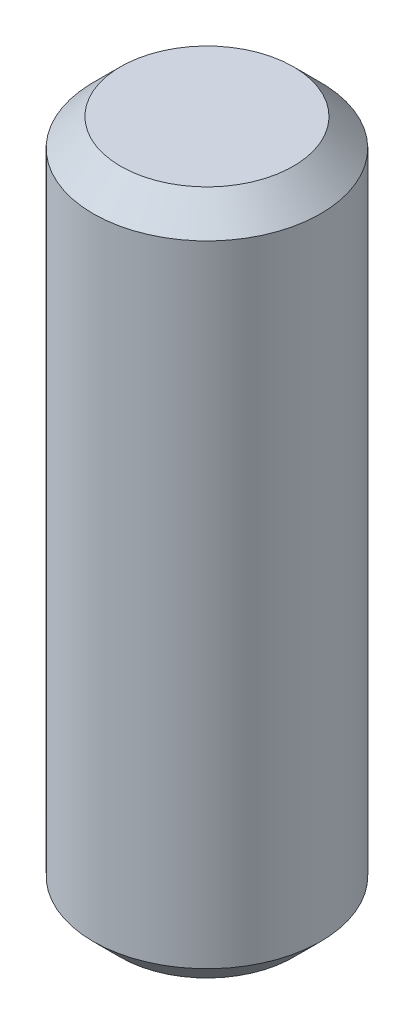
ISO-10303-21;
HEADER;
FILE_DESCRIPTION(('STEP AP214'),'2;1');
FILE_NAME('part.step','',(''),(''),'','','');
FILE_SCHEMA(('AUTOMOTIVE_DESIGN { 1 0 10303 214 1 1 1 1 }'));
ENDSEC;
DATA;
#1=APPLICATION_CONTEXT('core data for automotive mechanical design processes');
#2=APPLICATION_PROTOCOL_DEFINITION('international standard','automotive_design',2000,#1);
#3=PRODUCT_CONTEXT('',#1,'mechanical');
#4=PRODUCT('Part','Part','',(#3));
#5=PRODUCT_RELATED_PRODUCT_CATEGORY('part','',(#4));
#6=PRODUCT_DEFINITION_FORMATION('','',#4);
#7=PRODUCT_DEFINITION_CONTEXT('part definition',#1,'design');
#8=PRODUCT_DEFINITION('design','',#6,#7);
#9=PRODUCT_DEFINITION_SHAPE('','',#8);
#10=(LENGTH_UNIT() NAMED_UNIT(*) SI_UNIT(.MILLI.,.METRE.));
#11=(NAMED_UNIT(*) PLANE_ANGLE_UNIT() SI_UNIT($,.RADIAN.));
#12=(NAMED_UNIT(*) SI_UNIT($,.STERADIAN.) SOLID_ANGLE_UNIT());
#13=UNCERTAINTY_MEASURE_WITH_UNIT(LENGTH_MEASURE(1.E-05),#10,'distance_accuracy_value','');
#14=(GEOMETRIC_REPRESENTATION_CONTEXT(3) GLOBAL_UNCERTAINTY_ASSIGNED_CONTEXT((#13)) GLOBAL_UNIT_ASSIGNED_CONTEXT((#10,
#11,#12)) REPRESENTATION_CONTEXT('',''));
#15=CARTESIAN_POINT('',(0.,0.,0.));
#16=DIRECTION('',(0.,0.,1.));
#17=DIRECTION('',(1.,0.,0.));
#18=AXIS2_PLACEMENT_3D('',#15,#16,#17);
#19=CARTESIAN_POINT('',(0.,25.,0.));
#20=DIRECTION('',(0.,-1.,0.));
#21=DIRECTION('',(0.,0.,-1.));
#22=AXIS2_PLACEMENT_3D('',#19,#20,#21);
#23=CYLINDRICAL_SURFACE('',#22,4.15);
#24=CARTESIAN_POINT('',(0.,1.00000000000001,0.));
#25=DIRECTION('',(0.,1.,0.));
#26=DIRECTION('',(0.,0.,1.));
#27=AXIS2_PLACEMENT_3D('',#24,#25,#26);
#28=CIRCLE('',#27,4.15);
#29=CARTESIAN_POINT('',(0.,1.00000000000001,4.15));
#30=VERTEX_POINT('',#29);
#31=EDGE_CURVE('E53',#30,#30,#28,.T.);
#32=ORIENTED_EDGE('',*,*,#31,.T.);
#33=EDGE_LOOP('',(#32));
#34=FACE_BOUND('',#33,.T.);
#35=CARTESIAN_POINT('',(0.,24.,0.));
#36=DIRECTION('',(0.,1.,0.));
#37=DIRECTION('',(0.,0.,1.));
#38=AXIS2_PLACEMENT_3D('',#35,#36,#37);
#39=CIRCLE('',#38,4.15);
#40=CARTESIAN_POINT('',(0.,24.,4.15));
#41=VERTEX_POINT('',#40);
#42=EDGE_CURVE('E57',#41,#41,#39,.F.);
#43=ORIENTED_EDGE('',*,*,#42,.T.);
#44=EDGE_LOOP('',(#43));
#45=FACE_BOUND('',#44,.T.);
#46=ADVANCED_FACE('F41',(#34,#45),#23,.T.);
#47=CARTESIAN_POINT('',(0.,25.,0.));
#48=DIRECTION('',(0.,1.,0.));
#49=DIRECTION('',(0.,0.,1.));
#50=AXIS2_PLACEMENT_3D('',#47,#48,#49);
#51=PLANE('',#50);
#52=CARTESIAN_POINT('',(0.,25.,0.));
#53=DIRECTION('',(0.,1.,0.));
#54=DIRECTION('',(0.,0.,1.));
#55=AXIS2_PLACEMENT_3D('',#52,#53,#54);
#56=CIRCLE('',#55,3.14999999999999);
#57=CARTESIAN_POINT('',(0.,25.,3.14999999999999));
#58=VERTEX_POINT('',#57);
#59=EDGE_CURVE('E10',#58,#58,#56,.T.);
#60=ORIENTED_EDGE('',*,*,#59,.T.);
#61=EDGE_LOOP('',(#60));
#62=FACE_BOUND('',#61,.T.);
#63=ADVANCED_FACE('F73',(#62),#51,.T.);
#64=CARTESIAN_POINT('',(0.,0.,0.));
#65=DIRECTION('',(0.,1.,0.));
#66=DIRECTION('',(0.,0.,1.));
#67=AXIS2_PLACEMENT_3D('',#64,#65,#66);
#68=PLANE('',#67);
#69=CARTESIAN_POINT('',(0.,0.,0.));
#70=DIRECTION('',(0.,1.,0.));
#71=DIRECTION('',(0.,0.,1.));
#72=AXIS2_PLACEMENT_3D('',#69,#70,#71);
#73=CIRCLE('',#72,3.14999999999999);
#74=CARTESIAN_POINT('',(0.,0.,3.14999999999999));
#75=VERTEX_POINT('',#74);
#76=EDGE_CURVE('E49',#75,#75,#73,.F.);
#77=ORIENTED_EDGE('',*,*,#76,.T.);
#78=EDGE_LOOP('',(#77));
#79=FACE_BOUND('',#78,.T.);
#80=ADVANCED_FACE('F70',(#79),#68,.F.);
#81=CARTESIAN_POINT('',(0.,1.00000000000001,0.));
#82=DIRECTION('',(0.,1.,0.));
#83=DIRECTION('',(0.,0.,1.));
#84=AXIS2_PLACEMENT_3D('',#81,#82,#83);
#85=CONICAL_SURFACE('',#84,4.15,0.78539816339745);
#86=ORIENTED_EDGE('',*,*,#76,.F.);
#87=EDGE_LOOP('',(#86));
#88=FACE_BOUND('',#87,.T.);
#89=ORIENTED_EDGE('',*,*,#31,.F.);
#90=EDGE_LOOP('',(#89));
#91=FACE_BOUND('',#90,.T.);
#92=ADVANCED_FACE('F66',(#88,#91),#85,.T.);
#93=CARTESIAN_POINT('',(0.,25.,0.));
#94=DIRECTION('',(0.,-1.,0.));
#95=DIRECTION('',(0.,0.,-1.));
#96=AXIS2_PLACEMENT_3D('',#93,#94,#95);
#97=CONICAL_SURFACE('',#96,3.14999999999999,0.785398163397446);
#98=ORIENTED_EDGE('',*,*,#42,.F.);
#99=EDGE_LOOP('',(#98));
#100=FACE_BOUND('',#99,.T.);
#101=ORIENTED_EDGE('',*,*,#59,.F.);
#102=EDGE_LOOP('',(#101));
#103=FACE_BOUND('',#102,.T.);
#104=ADVANCED_FACE('F44',(#100,#103),#97,.T.);
#105=CLOSED_SHELL('',(#46,#63,#80,#92,#104));
#106=MANIFOLD_SOLID_BREP('B2',#105);
#107=ADVANCED_BREP_SHAPE_REPRESENTATION('',(#18,#106),#14);
#108=SHAPE_DEFINITION_REPRESENTATION(#9,#107);
ENDSEC;
END-ISO-10303-21;
